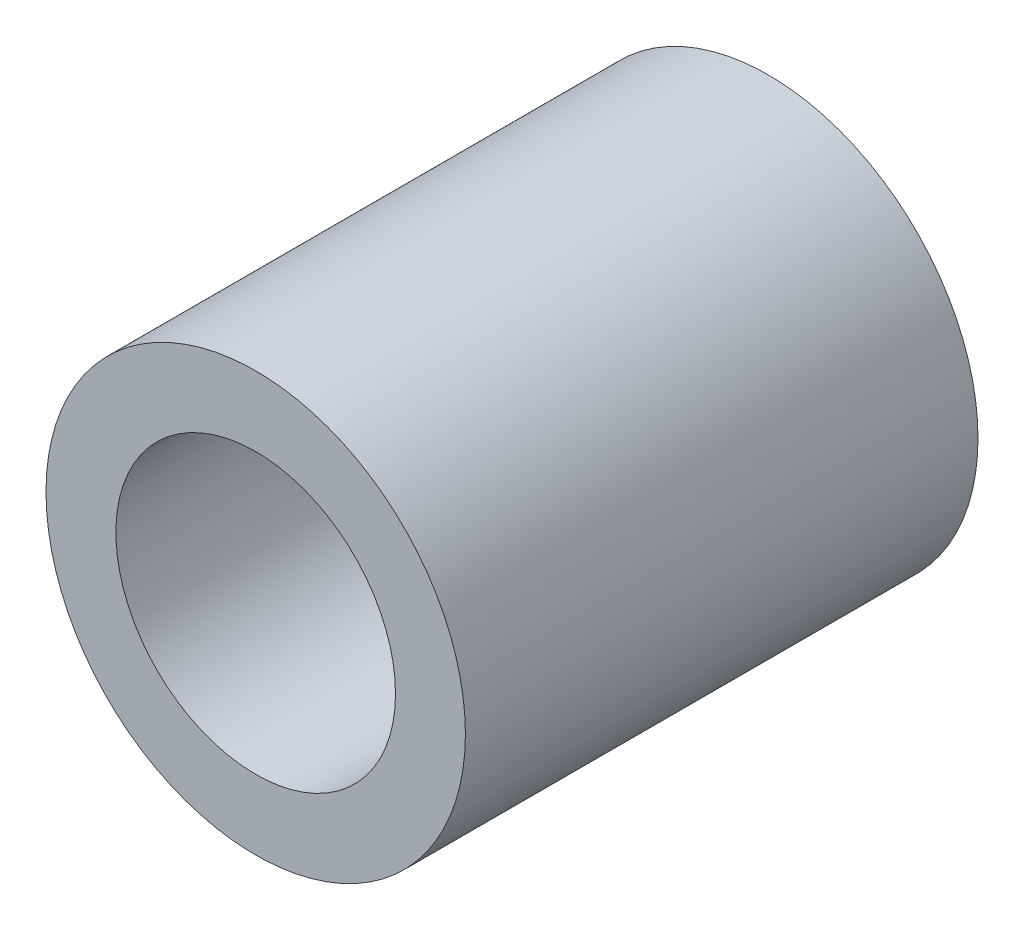
ISO-10303-21;
HEADER;
FILE_DESCRIPTION(('STEP AP214'),'2;1');
FILE_NAME('part.step','',(''),(''),'','','');
FILE_SCHEMA(('AUTOMOTIVE_DESIGN { 1 0 10303 214 1 1 1 1 }'));
ENDSEC;
DATA;
#1=APPLICATION_CONTEXT('core data for automotive mechanical design processes');
#2=APPLICATION_PROTOCOL_DEFINITION('international standard','automotive_design',2000,#1);
#3=PRODUCT_CONTEXT('',#1,'mechanical');
#4=PRODUCT('Part','Part','',(#3));
#5=PRODUCT_RELATED_PRODUCT_CATEGORY('part','',(#4));
#6=PRODUCT_DEFINITION_FORMATION('','',#4);
#7=PRODUCT_DEFINITION_CONTEXT('part definition',#1,'design');
#8=PRODUCT_DEFINITION('design','',#6,#7);
#9=PRODUCT_DEFINITION_SHAPE('','',#8);
#10=(LENGTH_UNIT() NAMED_UNIT(*) SI_UNIT(.MILLI.,.METRE.));
#11=(NAMED_UNIT(*) PLANE_ANGLE_UNIT() SI_UNIT($,.RADIAN.));
#12=(NAMED_UNIT(*) SI_UNIT($,.STERADIAN.) SOLID_ANGLE_UNIT());
#13=UNCERTAINTY_MEASURE_WITH_UNIT(LENGTH_MEASURE(1.E-05),#10,'distance_accuracy_value','');
#14=(GEOMETRIC_REPRESENTATION_CONTEXT(3) GLOBAL_UNCERTAINTY_ASSIGNED_CONTEXT((#13)) GLOBAL_UNIT_ASSIGNED_CONTEXT((#10,
#11,#12)) REPRESENTATION_CONTEXT('',''));
#15=CARTESIAN_POINT('',(0.,0.,0.));
#16=DIRECTION('',(0.,0.,1.));
#17=DIRECTION('',(1.,0.,0.));
#18=AXIS2_PLACEMENT_3D('',#15,#16,#17);
#19=CARTESIAN_POINT('',(0.,0.,11.));
#20=DIRECTION('',(0.,0.,1.));
#21=DIRECTION('',(1.,0.,0.));
#22=AXIS2_PLACEMENT_3D('',#19,#20,#21);
#23=PLANE('',#22);
#24=CARTESIAN_POINT('',(0.,0.,11.));
#25=DIRECTION('',(0.,0.,1.));
#26=DIRECTION('',(1.,0.,0.));
#27=AXIS2_PLACEMENT_3D('',#24,#25,#26);
#28=CIRCLE('',#27,9.);
#29=CARTESIAN_POINT('',(9.,0.,11.));
#30=VERTEX_POINT('',#29);
#31=EDGE_CURVE('E10',#30,#30,#28,.T.);
#32=ORIENTED_EDGE('',*,*,#31,.T.);
#33=EDGE_LOOP('',(#32));
#34=FACE_BOUND('',#33,.T.);
#35=CARTESIAN_POINT('',(0.,0.,11.));
#36=DIRECTION('',(0.,0.,1.));
#37=DIRECTION('',(1.,0.,0.));
#38=AXIS2_PLACEMENT_3D('',#35,#36,#37);
#39=CIRCLE('',#38,6.);
#40=CARTESIAN_POINT('',(6.,0.,11.));
#41=VERTEX_POINT('',#40);
#42=EDGE_CURVE('E42',#41,#41,#39,.T.);
#43=ORIENTED_EDGE('',*,*,#42,.F.);
#44=EDGE_LOOP('',(#43));
#45=FACE_BOUND('',#44,.T.);
#46=ADVANCED_FACE('F31',(#34,#45),#23,.T.);
#47=CARTESIAN_POINT('',(0.,0.,-11.));
#48=DIRECTION('',(0.,0.,1.));
#49=DIRECTION('',(1.,0.,0.));
#50=AXIS2_PLACEMENT_3D('',#47,#48,#49);
#51=PLANE('',#50);
#52=CARTESIAN_POINT('',(0.,0.,-11.));
#53=DIRECTION('',(0.,0.,1.));
#54=DIRECTION('',(1.,0.,0.));
#55=AXIS2_PLACEMENT_3D('',#52,#53,#54);
#56=CIRCLE('',#55,9.);
#57=CARTESIAN_POINT('',(9.,0.,-11.));
#58=VERTEX_POINT('',#57);
#59=EDGE_CURVE('E35',#58,#58,#56,.T.);
#60=ORIENTED_EDGE('',*,*,#59,.F.);
#61=EDGE_LOOP('',(#60));
#62=FACE_BOUND('',#61,.T.);
#63=CARTESIAN_POINT('',(0.,0.,-11.));
#64=DIRECTION('',(0.,0.,1.));
#65=DIRECTION('',(1.,0.,0.));
#66=AXIS2_PLACEMENT_3D('',#63,#64,#65);
#67=CIRCLE('',#66,6.);
#68=CARTESIAN_POINT('',(6.,0.,-11.));
#69=VERTEX_POINT('',#68);
#70=EDGE_CURVE('E44',#69,#69,#67,.T.);
#71=ORIENTED_EDGE('',*,*,#70,.T.);
#72=EDGE_LOOP('',(#71));
#73=FACE_BOUND('',#72,.T.);
#74=ADVANCED_FACE('F54',(#62,#73),#51,.F.);
#75=CARTESIAN_POINT('',(0.,0.,11.));
#76=DIRECTION('',(0.,0.,-1.));
#77=DIRECTION('',(-1.,0.,0.));
#78=AXIS2_PLACEMENT_3D('',#75,#76,#77);
#79=CYLINDRICAL_SURFACE('',#78,9.);
#80=ORIENTED_EDGE('',*,*,#31,.F.);
#81=EDGE_LOOP('',(#80));
#82=FACE_BOUND('',#81,.T.);
#83=ORIENTED_EDGE('',*,*,#59,.T.);
#84=EDGE_LOOP('',(#83));
#85=FACE_BOUND('',#84,.T.);
#86=ADVANCED_FACE('F33',(#82,#85),#79,.T.);
#87=CARTESIAN_POINT('',(0.,0.,11.));
#88=DIRECTION('',(0.,0.,-1.));
#89=DIRECTION('',(-1.,0.,0.));
#90=AXIS2_PLACEMENT_3D('',#87,#88,#89);
#91=CYLINDRICAL_SURFACE('',#90,6.);
#92=ORIENTED_EDGE('',*,*,#42,.T.);
#93=EDGE_LOOP('',(#92));
#94=FACE_BOUND('',#93,.T.);
#95=ORIENTED_EDGE('',*,*,#70,.F.);
#96=EDGE_LOOP('',(#95));
#97=FACE_BOUND('',#96,.T.);
#98=ADVANCED_FACE('F50',(#94,#97),#91,.F.);
#99=CLOSED_SHELL('',(#46,#74,#86,#98));
#100=MANIFOLD_SOLID_BREP('B2',#99);
#101=ADVANCED_BREP_SHAPE_REPRESENTATION('',(#18,#100),#14);
#102=SHAPE_DEFINITION_REPRESENTATION(#9,#101);
ENDSEC;
END-ISO-10303-21;
